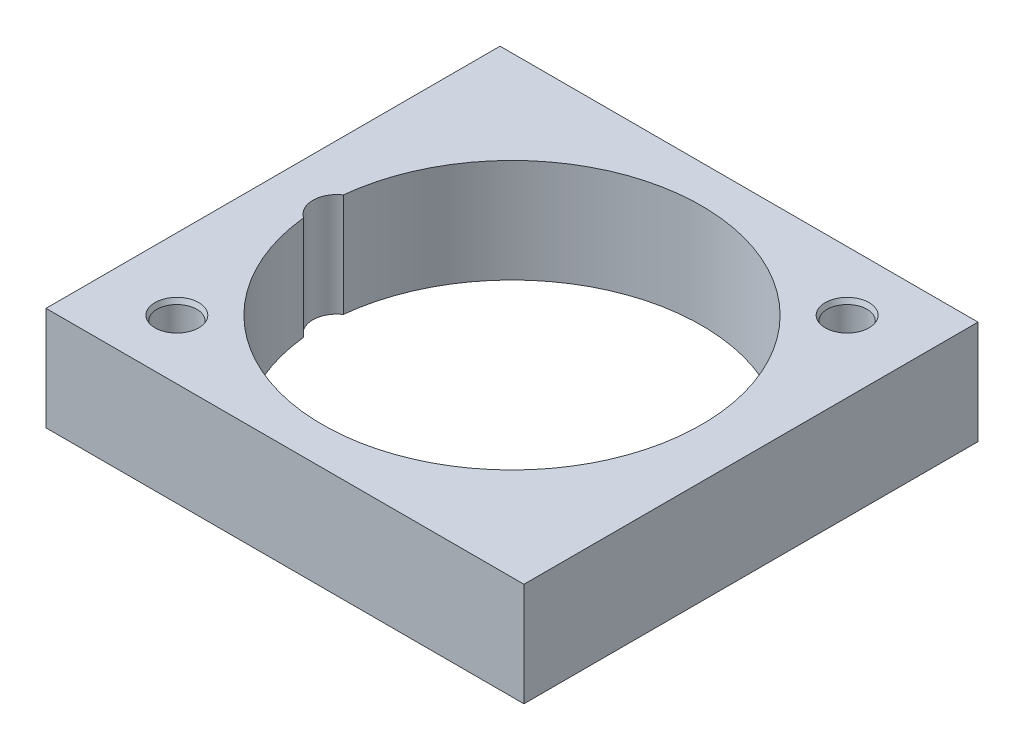
ISO-10303-21;
HEADER;
FILE_DESCRIPTION(('STEP AP214'),'2;1');
FILE_NAME('part.step','',(''),(''),'','','');
FILE_SCHEMA(('AUTOMOTIVE_DESIGN { 1 0 10303 214 1 1 1 1 }'));
ENDSEC;
DATA;
#1=APPLICATION_CONTEXT('core data for automotive mechanical design processes');
#2=APPLICATION_PROTOCOL_DEFINITION('international standard','automotive_design',2000,#1);
#3=PRODUCT_CONTEXT('',#1,'mechanical');
#4=PRODUCT('Part','Part','',(#3));
#5=PRODUCT_RELATED_PRODUCT_CATEGORY('part','',(#4));
#6=PRODUCT_DEFINITION_FORMATION('','',#4);
#7=PRODUCT_DEFINITION_CONTEXT('part definition',#1,'design');
#8=PRODUCT_DEFINITION('design','',#6,#7);
#9=PRODUCT_DEFINITION_SHAPE('','',#8);
#10=(LENGTH_UNIT() NAMED_UNIT(*) SI_UNIT(.MILLI.,.METRE.));
#11=(NAMED_UNIT(*) PLANE_ANGLE_UNIT() SI_UNIT($,.RADIAN.));
#12=(NAMED_UNIT(*) SI_UNIT($,.STERADIAN.) SOLID_ANGLE_UNIT());
#13=UNCERTAINTY_MEASURE_WITH_UNIT(LENGTH_MEASURE(1.E-05),#10,'distance_accuracy_value','');
#14=(GEOMETRIC_REPRESENTATION_CONTEXT(3) GLOBAL_UNCERTAINTY_ASSIGNED_CONTEXT((#13)) GLOBAL_UNIT_ASSIGNED_CONTEXT((#10,
#11,#12)) REPRESENTATION_CONTEXT('',''));
#15=CARTESIAN_POINT('',(0.,0.,0.));
#16=DIRECTION('',(0.,0.,1.));
#17=DIRECTION('',(1.,0.,0.));
#18=AXIS2_PLACEMENT_3D('',#15,#16,#17);
#19=CARTESIAN_POINT('',(30.,13.,-28.5));
#20=DIRECTION('',(0.,1.,0.));
#21=DIRECTION('',(0.,0.,1.));
#22=AXIS2_PLACEMENT_3D('',#19,#20,#21);
#23=PLANE('',#22);
#24=CARTESIAN_POINT('',(-21.0364267402999,13.,21.0364267402997));
#25=DIRECTION('',(0.,1.,0.));
#26=DIRECTION('',(0.,0.,1.));
#27=AXIS2_PLACEMENT_3D('',#24,#25,#26);
#28=CIRCLE('',#27,2.75);
#29=CARTESIAN_POINT('',(-21.0364267402999,13.,23.7864267402997));
#30=VERTEX_POINT('',#29);
#31=EDGE_CURVE('E106',#30,#30,#28,.T.);
#32=ORIENTED_EDGE('',*,*,#31,.F.);
#33=EDGE_LOOP('',(#32));
#34=FACE_BOUND('',#33,.T.);
#35=CARTESIAN_POINT('',(21.0364267402997,13.,-21.0364267402998));
#36=DIRECTION('',(0.,1.,0.));
#37=DIRECTION('',(0.,0.,1.));
#38=AXIS2_PLACEMENT_3D('',#35,#36,#37);
#39=CIRCLE('',#38,2.75);
#40=CARTESIAN_POINT('',(21.0364267402997,13.,-18.2864267402998));
#41=VERTEX_POINT('',#40);
#42=EDGE_CURVE('E117',#41,#41,#39,.T.);
#43=ORIENTED_EDGE('',*,*,#42,.F.);
#44=EDGE_LOOP('',(#43));
#45=FACE_BOUND('',#44,.T.);
#46=DIRECTION('',(0.,0.,-1.));
#47=VECTOR('',#46,1.);
#48=CARTESIAN_POINT('',(30.,13.,28.5));
#49=LINE('',#48,#47);
#50=CARTESIAN_POINT('',(30.,13.,28.5));
#51=VERTEX_POINT('',#50);
#52=CARTESIAN_POINT('',(30.,13.,-28.5));
#53=VERTEX_POINT('',#52);
#54=EDGE_CURVE('E142',#51,#53,#49,.T.);
#55=ORIENTED_EDGE('',*,*,#54,.T.);
#56=DIRECTION('',(-1.,0.,0.));
#57=VECTOR('',#56,1.);
#58=CARTESIAN_POINT('',(30.,13.,-28.5));
#59=LINE('',#58,#57);
#60=CARTESIAN_POINT('',(-30.,13.,-28.5));
#61=VERTEX_POINT('',#60);
#62=EDGE_CURVE('E145',#53,#61,#59,.T.);
#63=ORIENTED_EDGE('',*,*,#62,.T.);
#64=DIRECTION('',(0.,0.,1.));
#65=VECTOR('',#64,1.);
#66=CARTESIAN_POINT('',(-30.,13.,28.5));
#67=LINE('',#66,#65);
#68=CARTESIAN_POINT('',(-30.,13.,28.5));
#69=VERTEX_POINT('',#68);
#70=EDGE_CURVE('E147',#61,#69,#67,.T.);
#71=ORIENTED_EDGE('',*,*,#70,.T.);
#72=DIRECTION('',(1.,0.,0.));
#73=VECTOR('',#72,1.);
#74=CARTESIAN_POINT('',(30.,13.,28.5));
#75=LINE('',#74,#73);
#76=EDGE_CURVE('E150',#69,#51,#75,.T.);
#77=ORIENTED_EDGE('',*,*,#76,.T.);
#78=EDGE_LOOP('',(#55,#63,#71,#77));
#79=FACE_BOUND('',#78,.T.);
#80=CARTESIAN_POINT('',(0.,13.,0.));
#81=DIRECTION('',(0.,1.,0.));
#82=DIRECTION('',(0.,0.,-1.));
#83=AXIS2_PLACEMENT_3D('',#80,#81,#82);
#84=CIRCLE('',#83,23.8);
#85=CARTESIAN_POINT('',(-23.6690909090909,13.,2.49281678773032));
#86=VERTEX_POINT('',#85);
#87=CARTESIAN_POINT('',(-23.6690909090909,13.,-2.49281678773031));
#88=VERTEX_POINT('',#87);
#89=EDGE_CURVE('E126',#86,#88,#84,.T.);
#90=ORIENTED_EDGE('',*,*,#89,.F.);
#91=CARTESIAN_POINT('',(-22.,13.,0.));
#92=DIRECTION('',(0.,1.,0.));
#93=DIRECTION('',(0.,0.,-1.));
#94=AXIS2_PLACEMENT_3D('',#91,#92,#93);
#95=CIRCLE('',#94,3.00000000000001);
#96=EDGE_CURVE('E124',#88,#86,#95,.T.);
#97=ORIENTED_EDGE('',*,*,#96,.F.);
#98=EDGE_LOOP('',(#90,#97));
#99=FACE_BOUND('',#98,.T.);
#100=ADVANCED_FACE('F36',(#34,#45,#79,#99),#23,.T.);
#101=CARTESIAN_POINT('',(30.,0.,-28.5));
#102=DIRECTION('',(0.,1.,0.));
#103=DIRECTION('',(0.,0.,1.));
#104=AXIS2_PLACEMENT_3D('',#101,#102,#103);
#105=PLANE('',#104);
#106=DIRECTION('',(0.,0.,-1.));
#107=VECTOR('',#106,1.);
#108=CARTESIAN_POINT('',(30.,0.,28.5));
#109=LINE('',#108,#107);
#110=CARTESIAN_POINT('',(30.,0.,28.5));
#111=VERTEX_POINT('',#110);
#112=CARTESIAN_POINT('',(30.,0.,-28.5));
#113=VERTEX_POINT('',#112);
#114=EDGE_CURVE('E132',#111,#113,#109,.T.);
#115=ORIENTED_EDGE('',*,*,#114,.F.);
#116=DIRECTION('',(1.,0.,0.));
#117=VECTOR('',#116,1.);
#118=CARTESIAN_POINT('',(30.,0.,28.5));
#119=LINE('',#118,#117);
#120=CARTESIAN_POINT('',(-30.,0.,28.5));
#121=VERTEX_POINT('',#120);
#122=EDGE_CURVE('E139',#121,#111,#119,.T.);
#123=ORIENTED_EDGE('',*,*,#122,.F.);
#124=DIRECTION('',(0.,0.,1.));
#125=VECTOR('',#124,1.);
#126=CARTESIAN_POINT('',(-30.,0.,28.5));
#127=LINE('',#126,#125);
#128=CARTESIAN_POINT('',(-30.,0.,-28.5));
#129=VERTEX_POINT('',#128);
#130=EDGE_CURVE('E137',#129,#121,#127,.T.);
#131=ORIENTED_EDGE('',*,*,#130,.F.);
#132=DIRECTION('',(-1.,0.,0.));
#133=VECTOR('',#132,1.);
#134=CARTESIAN_POINT('',(30.,0.,-28.5));
#135=LINE('',#134,#133);
#136=EDGE_CURVE('E135',#113,#129,#135,.T.);
#137=ORIENTED_EDGE('',*,*,#136,.F.);
#138=EDGE_LOOP('',(#115,#123,#131,#137));
#139=FACE_BOUND('',#138,.T.);
#140=CARTESIAN_POINT('',(-22.,0.,0.));
#141=DIRECTION('',(0.,1.,0.));
#142=DIRECTION('',(0.,0.,-1.));
#143=AXIS2_PLACEMENT_3D('',#140,#141,#142);
#144=CIRCLE('',#143,3.00000000000001);
#145=CARTESIAN_POINT('',(-23.6690909090909,0.,-2.49281678773031));
#146=VERTEX_POINT('',#145);
#147=CARTESIAN_POINT('',(-23.6690909090909,0.,2.49281678773032));
#148=VERTEX_POINT('',#147);
#149=EDGE_CURVE('E58',#146,#148,#144,.T.);
#150=ORIENTED_EDGE('',*,*,#149,.T.);
#151=CARTESIAN_POINT('',(0.,0.,0.));
#152=DIRECTION('',(0.,1.,0.));
#153=DIRECTION('',(0.,0.,-1.));
#154=AXIS2_PLACEMENT_3D('',#151,#152,#153);
#155=CIRCLE('',#154,23.8);
#156=EDGE_CURVE('E121',#148,#146,#155,.T.);
#157=ORIENTED_EDGE('',*,*,#156,.T.);
#158=EDGE_LOOP('',(#150,#157));
#159=FACE_BOUND('',#158,.T.);
#160=ADVANCED_FACE('F169',(#139,#159),#105,.F.);
#161=CARTESIAN_POINT('',(30.,13.,28.5));
#162=DIRECTION('',(-1.,0.,0.));
#163=DIRECTION('',(0.,0.,1.));
#164=AXIS2_PLACEMENT_3D('',#161,#162,#163);
#165=PLANE('',#164);
#166=ORIENTED_EDGE('',*,*,#114,.T.);
#167=DIRECTION('',(0.,-1.,0.));
#168=VECTOR('',#167,1.);
#169=CARTESIAN_POINT('',(30.,13.,-28.5));
#170=LINE('',#169,#168);
#171=EDGE_CURVE('E11',#53,#113,#170,.T.);
#172=ORIENTED_EDGE('',*,*,#171,.F.);
#173=ORIENTED_EDGE('',*,*,#54,.F.);
#174=DIRECTION('',(0.,-1.,0.));
#175=VECTOR('',#174,1.);
#176=CARTESIAN_POINT('',(30.,13.,28.5));
#177=LINE('',#176,#175);
#178=EDGE_CURVE('E153',#51,#111,#177,.T.);
#179=ORIENTED_EDGE('',*,*,#178,.T.);
#180=EDGE_LOOP('',(#166,#172,#173,#179));
#181=FACE_BOUND('',#180,.T.);
#182=ADVANCED_FACE('F38',(#181),#165,.F.);
#183=CARTESIAN_POINT('',(30.,13.,-28.5));
#184=DIRECTION('',(0.,0.,1.));
#185=DIRECTION('',(1.,0.,0.));
#186=AXIS2_PLACEMENT_3D('',#183,#184,#185);
#187=PLANE('',#186);
#188=ORIENTED_EDGE('',*,*,#136,.T.);
#189=DIRECTION('',(0.,-1.,0.));
#190=VECTOR('',#189,1.);
#191=CARTESIAN_POINT('',(-30.,13.,-28.5));
#192=LINE('',#191,#190);
#193=EDGE_CURVE('E44',#61,#129,#192,.T.);
#194=ORIENTED_EDGE('',*,*,#193,.F.);
#195=ORIENTED_EDGE('',*,*,#62,.F.);
#196=ORIENTED_EDGE('',*,*,#171,.T.);
#197=EDGE_LOOP('',(#188,#194,#195,#196));
#198=FACE_BOUND('',#197,.T.);
#199=ADVANCED_FACE('F180',(#198),#187,.F.);
#200=CARTESIAN_POINT('',(-30.,13.,28.5));
#201=DIRECTION('',(1.,0.,0.));
#202=DIRECTION('',(0.,0.,-1.));
#203=AXIS2_PLACEMENT_3D('',#200,#201,#202);
#204=PLANE('',#203);
#205=ORIENTED_EDGE('',*,*,#130,.T.);
#206=DIRECTION('',(0.,-1.,0.));
#207=VECTOR('',#206,1.);
#208=CARTESIAN_POINT('',(-30.,13.,28.5));
#209=LINE('',#208,#207);
#210=EDGE_CURVE('E156',#69,#121,#209,.T.);
#211=ORIENTED_EDGE('',*,*,#210,.F.);
#212=ORIENTED_EDGE('',*,*,#70,.F.);
#213=ORIENTED_EDGE('',*,*,#193,.T.);
#214=EDGE_LOOP('',(#205,#211,#212,#213));
#215=FACE_BOUND('',#214,.T.);
#216=ADVANCED_FACE('F163',(#215),#204,.F.);
#217=CARTESIAN_POINT('',(30.,13.,28.5));
#218=DIRECTION('',(0.,0.,-1.));
#219=DIRECTION('',(-1.,0.,0.));
#220=AXIS2_PLACEMENT_3D('',#217,#218,#219);
#221=PLANE('',#220);
#222=ORIENTED_EDGE('',*,*,#122,.T.);
#223=ORIENTED_EDGE('',*,*,#178,.F.);
#224=ORIENTED_EDGE('',*,*,#76,.F.);
#225=ORIENTED_EDGE('',*,*,#210,.T.);
#226=EDGE_LOOP('',(#222,#223,#224,#225));
#227=FACE_BOUND('',#226,.T.);
#228=ADVANCED_FACE('F173',(#227),#221,.F.);
#229=CARTESIAN_POINT('',(-22.,13.,0.));
#230=DIRECTION('',(0.,-1.,0.));
#231=DIRECTION('',(0.,0.,-1.));
#232=AXIS2_PLACEMENT_3D('',#229,#230,#231);
#233=CYLINDRICAL_SURFACE('',#232,3.00000000000001);
#234=ORIENTED_EDGE('',*,*,#149,.F.);
#235=DIRECTION('',(0.,-1.,0.));
#236=VECTOR('',#235,1.);
#237=CARTESIAN_POINT('',(-23.6690909090909,13.,-2.49281678773031));
#238=LINE('',#237,#236);
#239=EDGE_CURVE('E129',#88,#146,#238,.T.);
#240=ORIENTED_EDGE('',*,*,#239,.F.);
#241=ORIENTED_EDGE('',*,*,#96,.T.);
#242=DIRECTION('',(0.,-1.,0.));
#243=VECTOR('',#242,1.);
#244=CARTESIAN_POINT('',(-23.6690909090909,13.,2.49281678773032));
#245=LINE('',#244,#243);
#246=EDGE_CURVE('E51',#86,#148,#245,.T.);
#247=ORIENTED_EDGE('',*,*,#246,.T.);
#248=EDGE_LOOP('',(#234,#240,#241,#247));
#249=FACE_BOUND('',#248,.T.);
#250=ADVANCED_FACE('F199',(#249),#233,.F.);
#251=CARTESIAN_POINT('',(0.,13.,0.));
#252=DIRECTION('',(0.,-1.,0.));
#253=DIRECTION('',(0.,0.,-1.));
#254=AXIS2_PLACEMENT_3D('',#251,#252,#253);
#255=CYLINDRICAL_SURFACE('',#254,23.8);
#256=ORIENTED_EDGE('',*,*,#156,.F.);
#257=ORIENTED_EDGE('',*,*,#246,.F.);
#258=ORIENTED_EDGE('',*,*,#89,.T.);
#259=ORIENTED_EDGE('',*,*,#239,.T.);
#260=EDGE_LOOP('',(#256,#257,#258,#259));
#261=FACE_BOUND('',#260,.T.);
#262=ADVANCED_FACE('F203',(#261),#255,.F.);
#263=CARTESIAN_POINT('',(21.0364267402997,13.,-21.0364267402998));
#264=DIRECTION('',(0.,1.,0.));
#265=DIRECTION('',(0.,0.,1.));
#266=AXIS2_PLACEMENT_3D('',#263,#264,#265);
#267=CONICAL_SURFACE('',#266,2.75,0.392699081698728);
#268=CARTESIAN_POINT('',(21.0364267402997,12.3964466094067,-21.0364267402998));
#269=DIRECTION('',(0.,1.,0.));
#270=DIRECTION('',(0.,0.,1.));
#271=AXIS2_PLACEMENT_3D('',#268,#269,#270);
#272=CIRCLE('',#271,2.5);
#273=CARTESIAN_POINT('',(21.0364267402997,12.3964466094067,-18.5364267402998));
#274=VERTEX_POINT('',#273);
#275=EDGE_CURVE('E114',#274,#274,#272,.T.);
#276=ORIENTED_EDGE('',*,*,#275,.F.);
#277=EDGE_LOOP('',(#276));
#278=FACE_BOUND('',#277,.T.);
#279=ORIENTED_EDGE('',*,*,#42,.T.);
#280=EDGE_LOOP('',(#279));
#281=FACE_BOUND('',#280,.T.);
#282=ADVANCED_FACE('F207',(#278,#281),#267,.F.);
#283=CARTESIAN_POINT('',(21.0364267402997,13.,-21.0364267402998));
#284=DIRECTION('',(0.,1.,0.));
#285=DIRECTION('',(0.,0.,1.));
#286=AXIS2_PLACEMENT_3D('',#283,#284,#285);
#287=CYLINDRICAL_SURFACE('',#286,2.5);
#288=CARTESIAN_POINT('',(21.0364267402997,5.,-21.0364267402998));
#289=DIRECTION('',(0.,1.,0.));
#290=DIRECTION('',(0.,0.,1.));
#291=AXIS2_PLACEMENT_3D('',#288,#289,#290);
#292=CIRCLE('',#291,2.5);
#293=CARTESIAN_POINT('',(21.0364267402997,5.,-18.5364267402998));
#294=VERTEX_POINT('',#293);
#295=EDGE_CURVE('E111',#294,#294,#292,.T.);
#296=ORIENTED_EDGE('',*,*,#295,.F.);
#297=EDGE_LOOP('',(#296));
#298=FACE_BOUND('',#297,.T.);
#299=ORIENTED_EDGE('',*,*,#275,.T.);
#300=EDGE_LOOP('',(#299));
#301=FACE_BOUND('',#300,.T.);
#302=ADVANCED_FACE('F212',(#298,#301),#287,.F.);
#303=CARTESIAN_POINT('',(21.0364267402997,5.,-21.0364267402998));
#304=DIRECTION('',(0.,1.,0.));
#305=DIRECTION('',(0.,0.,1.));
#306=AXIS2_PLACEMENT_3D('',#303,#304,#305);
#307=CONICAL_SURFACE('',#306,2.5,1.02974425867665);
#308=CARTESIAN_POINT('',(21.0364267402997,3.4978484524311,-21.0364267402998));
#309=VERTEX_POINT('',#308);
#310=VERTEX_LOOP('',#309);
#311=FACE_BOUND('',#310,.T.);
#312=ORIENTED_EDGE('',*,*,#295,.T.);
#313=EDGE_LOOP('',(#312));
#314=FACE_BOUND('',#313,.T.);
#315=ADVANCED_FACE('F216',(#311,#314),#307,.F.);
#316=CARTESIAN_POINT('',(-21.0364267402999,13.,21.0364267402997));
#317=DIRECTION('',(0.,1.,0.));
#318=DIRECTION('',(0.,0.,1.));
#319=AXIS2_PLACEMENT_3D('',#316,#317,#318);
#320=CONICAL_SURFACE('',#319,2.75,0.392699081698728);
#321=CARTESIAN_POINT('',(-21.0364267402999,12.3964466094067,21.0364267402997));
#322=DIRECTION('',(0.,1.,0.));
#323=DIRECTION('',(0.,0.,1.));
#324=AXIS2_PLACEMENT_3D('',#321,#322,#323);
#325=CIRCLE('',#324,2.5);
#326=CARTESIAN_POINT('',(-21.0364267402999,12.3964466094067,23.5364267402997));
#327=VERTEX_POINT('',#326);
#328=EDGE_CURVE('E103',#327,#327,#325,.T.);
#329=ORIENTED_EDGE('',*,*,#328,.F.);
#330=EDGE_LOOP('',(#329));
#331=FACE_BOUND('',#330,.T.);
#332=ORIENTED_EDGE('',*,*,#31,.T.);
#333=EDGE_LOOP('',(#332));
#334=FACE_BOUND('',#333,.T.);
#335=ADVANCED_FACE('F220',(#331,#334),#320,.F.);
#336=CARTESIAN_POINT('',(-21.0364267402999,13.,21.0364267402997));
#337=DIRECTION('',(0.,1.,0.));
#338=DIRECTION('',(0.,0.,1.));
#339=AXIS2_PLACEMENT_3D('',#336,#337,#338);
#340=CYLINDRICAL_SURFACE('',#339,2.5);
#341=CARTESIAN_POINT('',(-21.0364267402999,5.,21.0364267402997));
#342=DIRECTION('',(0.,1.,0.));
#343=DIRECTION('',(0.,0.,1.));
#344=AXIS2_PLACEMENT_3D('',#341,#342,#343);
#345=CIRCLE('',#344,2.5);
#346=CARTESIAN_POINT('',(-21.0364267402999,5.,23.5364267402997));
#347=VERTEX_POINT('',#346);
#348=EDGE_CURVE('E101',#347,#347,#345,.T.);
#349=ORIENTED_EDGE('',*,*,#348,.F.);
#350=EDGE_LOOP('',(#349));
#351=FACE_BOUND('',#350,.T.);
#352=ORIENTED_EDGE('',*,*,#328,.T.);
#353=EDGE_LOOP('',(#352));
#354=FACE_BOUND('',#353,.T.);
#355=ADVANCED_FACE('F97',(#351,#354),#340,.F.);
#356=CARTESIAN_POINT('',(-21.0364267402999,5.,21.0364267402997));
#357=DIRECTION('',(0.,1.,0.));
#358=DIRECTION('',(0.,0.,1.));
#359=AXIS2_PLACEMENT_3D('',#356,#357,#358);
#360=CONICAL_SURFACE('',#359,2.5,1.02974425867665);
#361=CARTESIAN_POINT('',(-21.0364267402999,3.4978484524311,21.0364267402997));
#362=VERTEX_POINT('',#361);
#363=VERTEX_LOOP('',#362);
#364=FACE_BOUND('',#363,.T.);
#365=ORIENTED_EDGE('',*,*,#348,.T.);
#366=EDGE_LOOP('',(#365));
#367=FACE_BOUND('',#366,.T.);
#368=ADVANCED_FACE('F94',(#364,#367),#360,.F.);
#369=CLOSED_SHELL('',(#100,#160,#182,#199,#216,#228,#250,#262,#282,#302,#315,#335,#355,#368));
#370=MANIFOLD_SOLID_BREP('B2',#369);
#371=ADVANCED_BREP_SHAPE_REPRESENTATION('',(#18,#370),#14);
#372=SHAPE_DEFINITION_REPRESENTATION(#9,#371);
ENDSEC;
END-ISO-10303-21;
